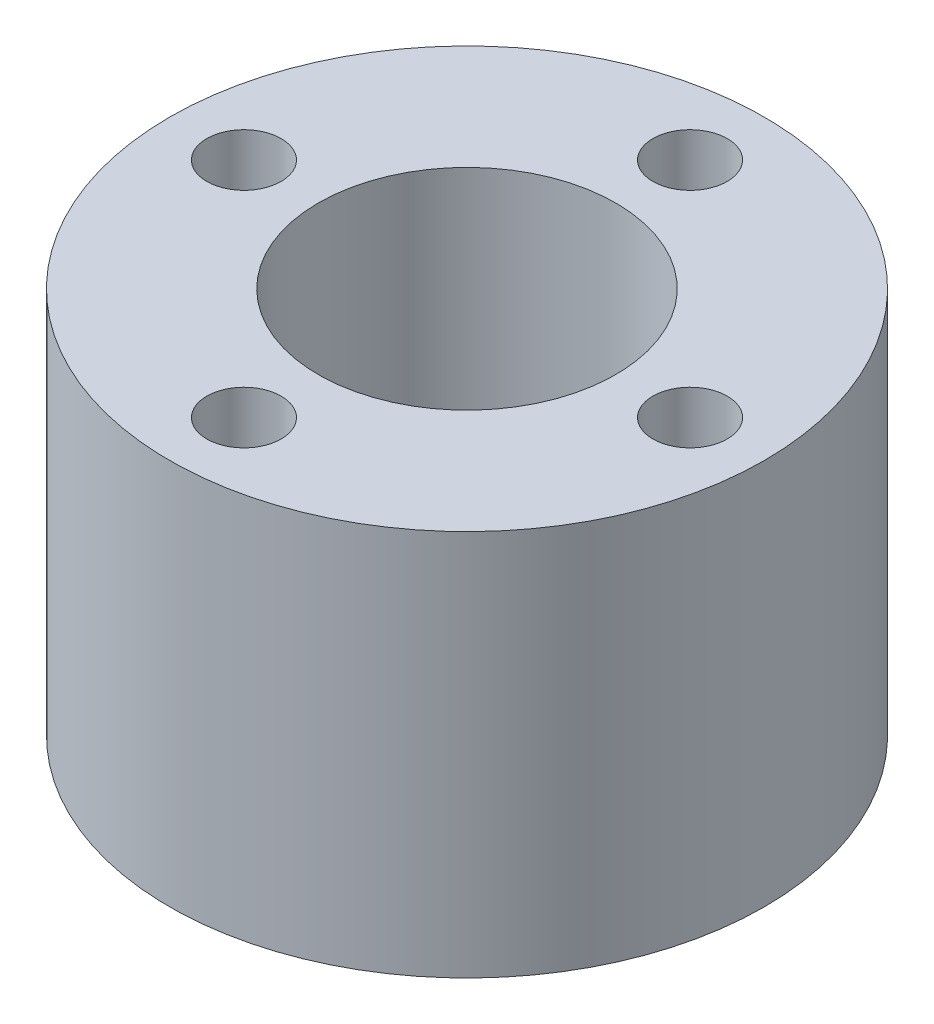
ISO-10303-21;
HEADER;
FILE_DESCRIPTION(('STEP AP214'),'2;1');
FILE_NAME('part.step','',(''),(''),'','','');
FILE_SCHEMA(('AUTOMOTIVE_DESIGN { 1 0 10303 214 1 1 1 1 }'));
ENDSEC;
DATA;
#1=APPLICATION_CONTEXT('core data for automotive mechanical design processes');
#2=APPLICATION_PROTOCOL_DEFINITION('international standard','automotive_design',2000,#1);
#3=PRODUCT_CONTEXT('',#1,'mechanical');
#4=PRODUCT('Part','Part','',(#3));
#5=PRODUCT_RELATED_PRODUCT_CATEGORY('part','',(#4));
#6=PRODUCT_DEFINITION_FORMATION('','',#4);
#7=PRODUCT_DEFINITION_CONTEXT('part definition',#1,'design');
#8=PRODUCT_DEFINITION('design','',#6,#7);
#9=PRODUCT_DEFINITION_SHAPE('','',#8);
#10=(LENGTH_UNIT() NAMED_UNIT(*) SI_UNIT(.MILLI.,.METRE.));
#11=(NAMED_UNIT(*) PLANE_ANGLE_UNIT() SI_UNIT($,.RADIAN.));
#12=(NAMED_UNIT(*) SI_UNIT($,.STERADIAN.) SOLID_ANGLE_UNIT());
#13=UNCERTAINTY_MEASURE_WITH_UNIT(LENGTH_MEASURE(1.E-05),#10,'distance_accuracy_value','');
#14=(GEOMETRIC_REPRESENTATION_CONTEXT(3) GLOBAL_UNCERTAINTY_ASSIGNED_CONTEXT((#13)) GLOBAL_UNIT_ASSIGNED_CONTEXT((#10,
#11,#12)) REPRESENTATION_CONTEXT('',''));
#15=CARTESIAN_POINT('',(0.,0.,0.));
#16=DIRECTION('',(0.,0.,1.));
#17=DIRECTION('',(1.,0.,0.));
#18=AXIS2_PLACEMENT_3D('',#15,#16,#17);
#19=CARTESIAN_POINT('',(0.,13.,0.));
#20=DIRECTION('',(0.,1.,0.));
#21=DIRECTION('',(-1.,0.,0.));
#22=AXIS2_PLACEMENT_3D('',#19,#20,#21);
#23=CYLINDRICAL_SURFACE('',#22,5.);
#24=CARTESIAN_POINT('',(0.,0.,0.));
#25=DIRECTION('',(0.,1.,0.));
#26=DIRECTION('',(-1.,0.,0.));
#27=AXIS2_PLACEMENT_3D('',#24,#25,#26);
#28=CIRCLE('',#27,5.);
#29=CARTESIAN_POINT('',(-5.,0.,0.));
#30=VERTEX_POINT('',#29);
#31=EDGE_CURVE('E52',#30,#30,#28,.T.);
#32=ORIENTED_EDGE('',*,*,#31,.F.);
#33=EDGE_LOOP('',(#32));
#34=FACE_BOUND('',#33,.T.);
#35=CARTESIAN_POINT('',(0.,13.,0.));
#36=DIRECTION('',(0.,1.,0.));
#37=DIRECTION('',(-1.,0.,0.));
#38=AXIS2_PLACEMENT_3D('',#35,#36,#37);
#39=CIRCLE('',#38,5.);
#40=CARTESIAN_POINT('',(-5.,13.,0.));
#41=VERTEX_POINT('',#40);
#42=EDGE_CURVE('E10',#41,#41,#39,.T.);
#43=ORIENTED_EDGE('',*,*,#42,.T.);
#44=EDGE_LOOP('',(#43));
#45=FACE_BOUND('',#44,.T.);
#46=ADVANCED_FACE('F39',(#34,#45),#23,.F.);
#47=CARTESIAN_POINT('',(5.,13.,0.));
#48=DIRECTION('',(0.,-1.,0.));
#49=DIRECTION('',(1.,0.,0.));
#50=AXIS2_PLACEMENT_3D('',#47,#48,#49);
#51=PLANE('',#50);
#52=CARTESIAN_POINT('',(0.,13.,-7.5));
#53=DIRECTION('',(0.,1.,0.));
#54=DIRECTION('',(0.,0.,1.));
#55=AXIS2_PLACEMENT_3D('',#52,#53,#54);
#56=CIRCLE('',#55,1.25);
#57=CARTESIAN_POINT('',(0.,13.,-6.25));
#58=VERTEX_POINT('',#57);
#59=EDGE_CURVE('E80',#58,#58,#56,.T.);
#60=ORIENTED_EDGE('',*,*,#59,.F.);
#61=EDGE_LOOP('',(#60));
#62=FACE_BOUND('',#61,.T.);
#63=CARTESIAN_POINT('',(-7.5,13.,0.));
#64=DIRECTION('',(0.,1.,0.));
#65=DIRECTION('',(0.,0.,1.));
#66=AXIS2_PLACEMENT_3D('',#63,#64,#65);
#67=CIRCLE('',#66,1.25);
#68=CARTESIAN_POINT('',(-7.5,13.,1.25));
#69=VERTEX_POINT('',#68);
#70=EDGE_CURVE('E74',#69,#69,#67,.T.);
#71=ORIENTED_EDGE('',*,*,#70,.F.);
#72=EDGE_LOOP('',(#71));
#73=FACE_BOUND('',#72,.T.);
#74=CARTESIAN_POINT('',(7.5,13.,0.));
#75=DIRECTION('',(0.,1.,0.));
#76=DIRECTION('',(0.,0.,1.));
#77=AXIS2_PLACEMENT_3D('',#74,#75,#76);
#78=CIRCLE('',#77,1.25);
#79=CARTESIAN_POINT('',(7.5,13.,1.25));
#80=VERTEX_POINT('',#79);
#81=EDGE_CURVE('E70',#80,#80,#78,.T.);
#82=ORIENTED_EDGE('',*,*,#81,.F.);
#83=EDGE_LOOP('',(#82));
#84=FACE_BOUND('',#83,.T.);
#85=CARTESIAN_POINT('',(0.,13.,7.5));
#86=DIRECTION('',(0.,1.,0.));
#87=DIRECTION('',(0.,0.,1.));
#88=AXIS2_PLACEMENT_3D('',#85,#86,#87);
#89=CIRCLE('',#88,1.25);
#90=CARTESIAN_POINT('',(0.,13.,8.75));
#91=VERTEX_POINT('',#90);
#92=EDGE_CURVE('E65',#91,#91,#89,.T.);
#93=ORIENTED_EDGE('',*,*,#92,.F.);
#94=EDGE_LOOP('',(#93));
#95=FACE_BOUND('',#94,.T.);
#96=ORIENTED_EDGE('',*,*,#42,.F.);
#97=EDGE_LOOP('',(#96));
#98=FACE_BOUND('',#97,.T.);
#99=CARTESIAN_POINT('',(0.,13.,0.));
#100=DIRECTION('',(0.,1.,0.));
#101=DIRECTION('',(-1.,0.,0.));
#102=AXIS2_PLACEMENT_3D('',#99,#100,#101);
#103=CIRCLE('',#102,10.);
#104=CARTESIAN_POINT('',(-10.,13.,0.));
#105=VERTEX_POINT('',#104);
#106=EDGE_CURVE('E44',#105,#105,#103,.T.);
#107=ORIENTED_EDGE('',*,*,#106,.T.);
#108=EDGE_LOOP('',(#107));
#109=FACE_BOUND('',#108,.T.);
#110=ADVANCED_FACE('F91',(#62,#73,#84,#95,#98,#109),#51,.F.);
#111=CARTESIAN_POINT('',(0.,13.,0.));
#112=DIRECTION('',(0.,1.,0.));
#113=DIRECTION('',(-1.,0.,0.));
#114=AXIS2_PLACEMENT_3D('',#111,#112,#113);
#115=CYLINDRICAL_SURFACE('',#114,10.);
#116=ORIENTED_EDGE('',*,*,#106,.F.);
#117=EDGE_LOOP('',(#116));
#118=FACE_BOUND('',#117,.T.);
#119=CARTESIAN_POINT('',(0.,0.,0.));
#120=DIRECTION('',(0.,1.,0.));
#121=DIRECTION('',(-1.,0.,0.));
#122=AXIS2_PLACEMENT_3D('',#119,#120,#121);
#123=CIRCLE('',#122,10.);
#124=CARTESIAN_POINT('',(-10.,0.,0.));
#125=VERTEX_POINT('',#124);
#126=EDGE_CURVE('E47',#125,#125,#123,.T.);
#127=ORIENTED_EDGE('',*,*,#126,.T.);
#128=EDGE_LOOP('',(#127));
#129=FACE_BOUND('',#128,.T.);
#130=ADVANCED_FACE('F96',(#118,#129),#115,.T.);
#131=CARTESIAN_POINT('',(10.,0.,0.));
#132=DIRECTION('',(0.,1.,0.));
#133=DIRECTION('',(-1.,0.,0.));
#134=AXIS2_PLACEMENT_3D('',#131,#132,#133);
#135=PLANE('',#134);
#136=CARTESIAN_POINT('',(0.,0.,-7.5));
#137=DIRECTION('',(0.,1.,0.));
#138=DIRECTION('',(0.,0.,1.));
#139=AXIS2_PLACEMENT_3D('',#136,#137,#138);
#140=CIRCLE('',#139,1.25);
#141=CARTESIAN_POINT('',(0.,0.,-6.25));
#142=VERTEX_POINT('',#141);
#143=EDGE_CURVE('E59',#142,#142,#140,.T.);
#144=ORIENTED_EDGE('',*,*,#143,.T.);
#145=EDGE_LOOP('',(#144));
#146=FACE_BOUND('',#145,.T.);
#147=CARTESIAN_POINT('',(-7.5,0.,0.));
#148=DIRECTION('',(0.,1.,0.));
#149=DIRECTION('',(0.,0.,1.));
#150=AXIS2_PLACEMENT_3D('',#147,#148,#149);
#151=CIRCLE('',#150,1.25);
#152=CARTESIAN_POINT('',(-7.5,0.,1.25));
#153=VERTEX_POINT('',#152);
#154=EDGE_CURVE('E72',#153,#153,#151,.T.);
#155=ORIENTED_EDGE('',*,*,#154,.T.);
#156=EDGE_LOOP('',(#155));
#157=FACE_BOUND('',#156,.T.);
#158=CARTESIAN_POINT('',(7.5,0.,0.));
#159=DIRECTION('',(0.,1.,0.));
#160=DIRECTION('',(0.,0.,1.));
#161=AXIS2_PLACEMENT_3D('',#158,#159,#160);
#162=CIRCLE('',#161,1.25);
#163=CARTESIAN_POINT('',(7.5,0.,1.25));
#164=VERTEX_POINT('',#163);
#165=EDGE_CURVE('E61',#164,#164,#162,.T.);
#166=ORIENTED_EDGE('',*,*,#165,.T.);
#167=EDGE_LOOP('',(#166));
#168=FACE_BOUND('',#167,.T.);
#169=CARTESIAN_POINT('',(0.,0.,7.5));
#170=DIRECTION('',(0.,1.,0.));
#171=DIRECTION('',(0.,0.,1.));
#172=AXIS2_PLACEMENT_3D('',#169,#170,#171);
#173=CIRCLE('',#172,1.25);
#174=CARTESIAN_POINT('',(0.,0.,8.75));
#175=VERTEX_POINT('',#174);
#176=EDGE_CURVE('E56',#175,#175,#173,.T.);
#177=ORIENTED_EDGE('',*,*,#176,.T.);
#178=EDGE_LOOP('',(#177));
#179=FACE_BOUND('',#178,.T.);
#180=ORIENTED_EDGE('',*,*,#126,.F.);
#181=EDGE_LOOP('',(#180));
#182=FACE_BOUND('',#181,.T.);
#183=ORIENTED_EDGE('',*,*,#31,.T.);
#184=EDGE_LOOP('',(#183));
#185=FACE_BOUND('',#184,.T.);
#186=ADVANCED_FACE('F85',(#146,#157,#168,#179,#182,#185),#135,.F.);
#187=CARTESIAN_POINT('',(0.,0.,7.5));
#188=DIRECTION('',(0.,1.,0.));
#189=DIRECTION('',(0.,0.,1.));
#190=AXIS2_PLACEMENT_3D('',#187,#188,#189);
#191=CYLINDRICAL_SURFACE('',#190,1.25);
#192=CARTESIAN_POINT('',(0.,0.,8.75));
#193=CARTESIAN_POINT('',(0.,0.135416666666666,8.75));
#194=CARTESIAN_POINT('',(0.,0.270833333333333,8.75));
#195=CARTESIAN_POINT('',(0.,0.541666666666667,8.75));
#196=CARTESIAN_POINT('',(0.,0.677083333333333,8.75));
#197=CARTESIAN_POINT('',(0.,0.947916666666667,8.75));
#198=CARTESIAN_POINT('',(0.,1.08333333333333,8.75));
#199=CARTESIAN_POINT('',(0.,1.35416666666667,8.75));
#200=CARTESIAN_POINT('',(0.,1.48958333333333,8.75));
#201=CARTESIAN_POINT('',(0.,1.76041666666667,8.75));
#202=CARTESIAN_POINT('',(0.,1.89583333333333,8.75));
#203=CARTESIAN_POINT('',(0.,2.16666666666667,8.75));
#204=CARTESIAN_POINT('',(0.,2.30208333333333,8.75));
#205=CARTESIAN_POINT('',(0.,2.57291666666667,8.75));
#206=CARTESIAN_POINT('',(0.,2.70833333333333,8.75));
#207=CARTESIAN_POINT('',(0.,2.97916666666667,8.75));
#208=CARTESIAN_POINT('',(0.,3.11458333333333,8.75));
#209=CARTESIAN_POINT('',(0.,3.38541666666667,8.75));
#210=CARTESIAN_POINT('',(0.,3.52083333333333,8.75));
#211=CARTESIAN_POINT('',(0.,3.79166666666667,8.75));
#212=CARTESIAN_POINT('',(0.,3.92708333333333,8.75));
#213=CARTESIAN_POINT('',(0.,4.19791666666667,8.75));
#214=CARTESIAN_POINT('',(0.,4.33333333333333,8.75));
#215=CARTESIAN_POINT('',(0.,4.60416666666667,8.75));
#216=CARTESIAN_POINT('',(0.,4.73958333333333,8.75));
#217=CARTESIAN_POINT('',(0.,5.01041666666667,8.75));
#218=CARTESIAN_POINT('',(0.,5.14583333333333,8.75));
#219=CARTESIAN_POINT('',(0.,5.41666666666667,8.75));
#220=CARTESIAN_POINT('',(0.,5.55208333333333,8.75));
#221=CARTESIAN_POINT('',(0.,5.82291666666667,8.75));
#222=CARTESIAN_POINT('',(0.,5.95833333333333,8.75));
#223=CARTESIAN_POINT('',(0.,6.22916666666667,8.75));
#224=CARTESIAN_POINT('',(0.,6.36458333333333,8.75));
#225=CARTESIAN_POINT('',(0.,6.63541666666667,8.75));
#226=CARTESIAN_POINT('',(0.,6.77083333333333,8.75));
#227=CARTESIAN_POINT('',(0.,7.04166666666667,8.75));
#228=CARTESIAN_POINT('',(0.,7.17708333333333,8.75));
#229=CARTESIAN_POINT('',(0.,7.44791666666667,8.75));
#230=CARTESIAN_POINT('',(0.,7.58333333333333,8.75));
#231=CARTESIAN_POINT('',(0.,7.85416666666667,8.75));
#232=CARTESIAN_POINT('',(0.,7.98958333333333,8.75));
#233=CARTESIAN_POINT('',(0.,8.26041666666667,8.75));
#234=CARTESIAN_POINT('',(0.,8.39583333333333,8.75));
#235=CARTESIAN_POINT('',(0.,8.66666666666667,8.75));
#236=CARTESIAN_POINT('',(0.,8.80208333333333,8.75));
#237=CARTESIAN_POINT('',(0.,9.07291666666667,8.75));
#238=CARTESIAN_POINT('',(0.,9.20833333333333,8.75));
#239=CARTESIAN_POINT('',(0.,9.47916666666667,8.75));
#240=CARTESIAN_POINT('',(0.,9.61458333333333,8.75));
#241=CARTESIAN_POINT('',(0.,9.88541666666667,8.75));
#242=CARTESIAN_POINT('',(0.,10.0208333333333,8.75));
#243=CARTESIAN_POINT('',(0.,10.2916666666667,8.75));
#244=CARTESIAN_POINT('',(0.,10.4270833333333,8.75));
#245=CARTESIAN_POINT('',(0.,10.6979166666667,8.75));
#246=CARTESIAN_POINT('',(0.,10.8333333333333,8.75));
#247=CARTESIAN_POINT('',(0.,11.1041666666667,8.75));
#248=CARTESIAN_POINT('',(0.,11.2395833333333,8.75));
#249=CARTESIAN_POINT('',(0.,11.5104166666667,8.75));
#250=CARTESIAN_POINT('',(0.,11.6458333333333,8.75));
#251=CARTESIAN_POINT('',(0.,11.9166666666667,8.75));
#252=CARTESIAN_POINT('',(0.,12.0520833333333,8.75));
#253=CARTESIAN_POINT('',(0.,12.3229166666667,8.75));
#254=CARTESIAN_POINT('',(0.,12.4583333333333,8.75));
#255=CARTESIAN_POINT('',(0.,12.7291666666667,8.75));
#256=CARTESIAN_POINT('',(0.,12.8645833333333,8.75));
#257=CARTESIAN_POINT('',(0.,13.,8.75));
#258=B_SPLINE_CURVE_WITH_KNOTS('',3,(#192,#193,#194,#195,#196,#197,#198,#199,#200,#201,#202,
#203,#204,#205,#206,#207,#208,#209,#210,#211,#212,#213,#214,#215,#216,#217,#218,#219,#220,#221,
#222,#223,#224,#225,#226,#227,#228,#229,#230,#231,#232,#233,#234,#235,#236,#237,#238,#239,#240,
#241,#242,#243,#244,#245,#246,#247,#248,#249,#250,#251,#252,#253,#254,#255,#256,#257),
.UNSPECIFIED.,.F.,.F.,(4,2,2,2,2,2,2,2,2,2,2,2,2,2,2,2,2,2,2,2,2,2,2,2,2,2,2,2,2,2,2,2,4),(0.,
0.40625,0.8125,1.21875,1.625,2.03125,2.4375,2.84375,3.25,3.65625,4.0625,4.46875,4.875,5.28125,
5.6875,6.09375,6.5,6.90625,7.3125,7.71875,8.125,8.53125,8.9375,9.34375,9.75,10.15625,10.5625,
10.96875,11.375,11.78125,12.1875,12.59375,13.),.UNSPECIFIED.);
#259=EDGE_CURVE('BSEAM102',#175,#91,#258,.T.);
#260=ORIENTED_EDGE('',*,*,#176,.F.);
#261=ORIENTED_EDGE('',*,*,#92,.T.);
#262=ORIENTED_EDGE('',*,*,#259,.T.);
#263=ORIENTED_EDGE('',*,*,#259,.F.);
#264=EDGE_LOOP('',(#260,#262,#261,#263));
#265=FACE_BOUND('',#264,.T.);
#266=ADVANCED_FACE('F102',(#265),#191,.F.);
#267=CARTESIAN_POINT('',(7.5,0.,0.));
#268=DIRECTION('',(0.,1.,0.));
#269=DIRECTION('',(0.,0.,1.));
#270=AXIS2_PLACEMENT_3D('',#267,#268,#269);
#271=CYLINDRICAL_SURFACE('',#270,1.25);
#272=CARTESIAN_POINT('',(7.5,0.,1.25));
#273=CARTESIAN_POINT('',(7.5,0.135416666666666,1.25));
#274=CARTESIAN_POINT('',(7.5,0.270833333333333,1.25));
#275=CARTESIAN_POINT('',(7.5,0.541666666666667,1.25));
#276=CARTESIAN_POINT('',(7.5,0.677083333333333,1.25));
#277=CARTESIAN_POINT('',(7.5,0.947916666666667,1.25));
#278=CARTESIAN_POINT('',(7.5,1.08333333333333,1.25));
#279=CARTESIAN_POINT('',(7.5,1.35416666666667,1.25));
#280=CARTESIAN_POINT('',(7.5,1.48958333333333,1.25));
#281=CARTESIAN_POINT('',(7.5,1.76041666666667,1.25));
#282=CARTESIAN_POINT('',(7.5,1.89583333333333,1.25));
#283=CARTESIAN_POINT('',(7.5,2.16666666666667,1.25));
#284=CARTESIAN_POINT('',(7.5,2.30208333333333,1.25));
#285=CARTESIAN_POINT('',(7.5,2.57291666666667,1.25));
#286=CARTESIAN_POINT('',(7.5,2.70833333333333,1.25));
#287=CARTESIAN_POINT('',(7.5,2.97916666666667,1.25));
#288=CARTESIAN_POINT('',(7.5,3.11458333333333,1.25));
#289=CARTESIAN_POINT('',(7.5,3.38541666666667,1.25));
#290=CARTESIAN_POINT('',(7.5,3.52083333333333,1.25));
#291=CARTESIAN_POINT('',(7.5,3.79166666666667,1.25));
#292=CARTESIAN_POINT('',(7.5,3.92708333333333,1.25));
#293=CARTESIAN_POINT('',(7.5,4.19791666666667,1.25));
#294=CARTESIAN_POINT('',(7.5,4.33333333333333,1.25));
#295=CARTESIAN_POINT('',(7.5,4.60416666666667,1.25));
#296=CARTESIAN_POINT('',(7.5,4.73958333333333,1.25));
#297=CARTESIAN_POINT('',(7.5,5.01041666666667,1.25));
#298=CARTESIAN_POINT('',(7.5,5.14583333333333,1.25));
#299=CARTESIAN_POINT('',(7.5,5.41666666666667,1.25));
#300=CARTESIAN_POINT('',(7.5,5.55208333333333,1.25));
#301=CARTESIAN_POINT('',(7.5,5.82291666666667,1.25));
#302=CARTESIAN_POINT('',(7.5,5.95833333333333,1.25));
#303=CARTESIAN_POINT('',(7.5,6.22916666666667,1.25));
#304=CARTESIAN_POINT('',(7.5,6.36458333333333,1.25));
#305=CARTESIAN_POINT('',(7.5,6.63541666666667,1.25));
#306=CARTESIAN_POINT('',(7.5,6.77083333333333,1.25));
#307=CARTESIAN_POINT('',(7.5,7.04166666666667,1.25));
#308=CARTESIAN_POINT('',(7.5,7.17708333333333,1.25));
#309=CARTESIAN_POINT('',(7.5,7.44791666666667,1.25));
#310=CARTESIAN_POINT('',(7.5,7.58333333333333,1.25));
#311=CARTESIAN_POINT('',(7.5,7.85416666666667,1.25));
#312=CARTESIAN_POINT('',(7.5,7.98958333333333,1.25));
#313=CARTESIAN_POINT('',(7.5,8.26041666666667,1.25));
#314=CARTESIAN_POINT('',(7.5,8.39583333333333,1.25));
#315=CARTESIAN_POINT('',(7.5,8.66666666666667,1.25));
#316=CARTESIAN_POINT('',(7.5,8.80208333333333,1.25));
#317=CARTESIAN_POINT('',(7.5,9.07291666666667,1.25));
#318=CARTESIAN_POINT('',(7.5,9.20833333333333,1.25));
#319=CARTESIAN_POINT('',(7.5,9.47916666666667,1.25));
#320=CARTESIAN_POINT('',(7.5,9.61458333333333,1.25));
#321=CARTESIAN_POINT('',(7.5,9.88541666666667,1.25));
#322=CARTESIAN_POINT('',(7.5,10.0208333333333,1.25));
#323=CARTESIAN_POINT('',(7.5,10.2916666666667,1.25));
#324=CARTESIAN_POINT('',(7.5,10.4270833333333,1.25));
#325=CARTESIAN_POINT('',(7.5,10.6979166666667,1.25));
#326=CARTESIAN_POINT('',(7.5,10.8333333333333,1.25));
#327=CARTESIAN_POINT('',(7.5,11.1041666666667,1.25));
#328=CARTESIAN_POINT('',(7.5,11.2395833333333,1.25));
#329=CARTESIAN_POINT('',(7.5,11.5104166666667,1.25));
#330=CARTESIAN_POINT('',(7.5,11.6458333333333,1.25));
#331=CARTESIAN_POINT('',(7.5,11.9166666666667,1.25));
#332=CARTESIAN_POINT('',(7.5,12.0520833333333,1.25));
#333=CARTESIAN_POINT('',(7.5,12.3229166666667,1.25));
#334=CARTESIAN_POINT('',(7.5,12.4583333333333,1.25));
#335=CARTESIAN_POINT('',(7.5,12.7291666666667,1.25));
#336=CARTESIAN_POINT('',(7.5,12.8645833333333,1.25));
#337=CARTESIAN_POINT('',(7.5,13.,1.25));
#338=B_SPLINE_CURVE_WITH_KNOTS('',3,(#272,#273,#274,#275,#276,#277,#278,#279,#280,#281,#282,
#283,#284,#285,#286,#287,#288,#289,#290,#291,#292,#293,#294,#295,#296,#297,#298,#299,#300,#301,
#302,#303,#304,#305,#306,#307,#308,#309,#310,#311,#312,#313,#314,#315,#316,#317,#318,#319,#320,
#321,#322,#323,#324,#325,#326,#327,#328,#329,#330,#331,#332,#333,#334,#335,#336,#337),
.UNSPECIFIED.,.F.,.F.,(4,2,2,2,2,2,2,2,2,2,2,2,2,2,2,2,2,2,2,2,2,2,2,2,2,2,2,2,2,2,2,2,4),(0.,
0.40625,0.8125,1.21875,1.625,2.03125,2.4375,2.84375,3.25,3.65625,4.0625,4.46875,4.875,5.28125,
5.6875,6.09375,6.5,6.90625,7.3125,7.71875,8.125,8.53125,8.9375,9.34375,9.75,10.15625,10.5625,
10.96875,11.375,11.78125,12.1875,12.59375,13.),.UNSPECIFIED.);
#339=EDGE_CURVE('BSEAM106',#164,#80,#338,.T.);
#340=ORIENTED_EDGE('',*,*,#165,.F.);
#341=ORIENTED_EDGE('',*,*,#81,.T.);
#342=ORIENTED_EDGE('',*,*,#339,.T.);
#343=ORIENTED_EDGE('',*,*,#339,.F.);
#344=EDGE_LOOP('',(#340,#342,#341,#343));
#345=FACE_BOUND('',#344,.T.);
#346=ADVANCED_FACE('F106',(#345),#271,.F.);
#347=CARTESIAN_POINT('',(-7.5,0.,0.));
#348=DIRECTION('',(0.,1.,0.));
#349=DIRECTION('',(0.,0.,1.));
#350=AXIS2_PLACEMENT_3D('',#347,#348,#349);
#351=CYLINDRICAL_SURFACE('',#350,1.25);
#352=CARTESIAN_POINT('',(-7.5,0.,1.25));
#353=CARTESIAN_POINT('',(-7.5,0.135416666666666,1.25));
#354=CARTESIAN_POINT('',(-7.5,0.270833333333333,1.25));
#355=CARTESIAN_POINT('',(-7.5,0.541666666666667,1.25));
#356=CARTESIAN_POINT('',(-7.5,0.677083333333333,1.25));
#357=CARTESIAN_POINT('',(-7.5,0.947916666666667,1.25));
#358=CARTESIAN_POINT('',(-7.5,1.08333333333333,1.25));
#359=CARTESIAN_POINT('',(-7.5,1.35416666666667,1.25));
#360=CARTESIAN_POINT('',(-7.5,1.48958333333333,1.25));
#361=CARTESIAN_POINT('',(-7.5,1.76041666666667,1.25));
#362=CARTESIAN_POINT('',(-7.5,1.89583333333333,1.25));
#363=CARTESIAN_POINT('',(-7.5,2.16666666666667,1.25));
#364=CARTESIAN_POINT('',(-7.5,2.30208333333333,1.25));
#365=CARTESIAN_POINT('',(-7.5,2.57291666666667,1.25));
#366=CARTESIAN_POINT('',(-7.5,2.70833333333333,1.25));
#367=CARTESIAN_POINT('',(-7.5,2.97916666666667,1.25));
#368=CARTESIAN_POINT('',(-7.5,3.11458333333333,1.25));
#369=CARTESIAN_POINT('',(-7.5,3.38541666666667,1.25));
#370=CARTESIAN_POINT('',(-7.5,3.52083333333333,1.25));
#371=CARTESIAN_POINT('',(-7.5,3.79166666666667,1.25));
#372=CARTESIAN_POINT('',(-7.5,3.92708333333333,1.25));
#373=CARTESIAN_POINT('',(-7.5,4.19791666666667,1.25));
#374=CARTESIAN_POINT('',(-7.5,4.33333333333333,1.25));
#375=CARTESIAN_POINT('',(-7.5,4.60416666666667,1.25));
#376=CARTESIAN_POINT('',(-7.5,4.73958333333333,1.25));
#377=CARTESIAN_POINT('',(-7.5,5.01041666666667,1.25));
#378=CARTESIAN_POINT('',(-7.5,5.14583333333333,1.25));
#379=CARTESIAN_POINT('',(-7.5,5.41666666666667,1.25));
#380=CARTESIAN_POINT('',(-7.5,5.55208333333333,1.25));
#381=CARTESIAN_POINT('',(-7.5,5.82291666666667,1.25));
#382=CARTESIAN_POINT('',(-7.5,5.95833333333333,1.25));
#383=CARTESIAN_POINT('',(-7.5,6.22916666666667,1.25));
#384=CARTESIAN_POINT('',(-7.5,6.36458333333333,1.25));
#385=CARTESIAN_POINT('',(-7.5,6.63541666666667,1.25));
#386=CARTESIAN_POINT('',(-7.5,6.77083333333333,1.25));
#387=CARTESIAN_POINT('',(-7.5,7.04166666666667,1.25));
#388=CARTESIAN_POINT('',(-7.5,7.17708333333333,1.25));
#389=CARTESIAN_POINT('',(-7.5,7.44791666666667,1.25));
#390=CARTESIAN_POINT('',(-7.5,7.58333333333333,1.25));
#391=CARTESIAN_POINT('',(-7.5,7.85416666666667,1.25));
#392=CARTESIAN_POINT('',(-7.5,7.98958333333333,1.25));
#393=CARTESIAN_POINT('',(-7.5,8.26041666666667,1.25));
#394=CARTESIAN_POINT('',(-7.5,8.39583333333333,1.25));
#395=CARTESIAN_POINT('',(-7.5,8.66666666666667,1.25));
#396=CARTESIAN_POINT('',(-7.5,8.80208333333333,1.25));
#397=CARTESIAN_POINT('',(-7.5,9.07291666666667,1.25));
#398=CARTESIAN_POINT('',(-7.5,9.20833333333333,1.25));
#399=CARTESIAN_POINT('',(-7.5,9.47916666666667,1.25));
#400=CARTESIAN_POINT('',(-7.5,9.61458333333333,1.25));
#401=CARTESIAN_POINT('',(-7.5,9.88541666666667,1.25));
#402=CARTESIAN_POINT('',(-7.5,10.0208333333333,1.25));
#403=CARTESIAN_POINT('',(-7.5,10.2916666666667,1.25));
#404=CARTESIAN_POINT('',(-7.5,10.4270833333333,1.25));
#405=CARTESIAN_POINT('',(-7.5,10.6979166666667,1.25));
#406=CARTESIAN_POINT('',(-7.5,10.8333333333333,1.25));
#407=CARTESIAN_POINT('',(-7.5,11.1041666666667,1.25));
#408=CARTESIAN_POINT('',(-7.5,11.2395833333333,1.25));
#409=CARTESIAN_POINT('',(-7.5,11.5104166666667,1.25));
#410=CARTESIAN_POINT('',(-7.5,11.6458333333333,1.25));
#411=CARTESIAN_POINT('',(-7.5,11.9166666666667,1.25));
#412=CARTESIAN_POINT('',(-7.5,12.0520833333333,1.25));
#413=CARTESIAN_POINT('',(-7.5,12.3229166666667,1.25));
#414=CARTESIAN_POINT('',(-7.5,12.4583333333333,1.25));
#415=CARTESIAN_POINT('',(-7.5,12.7291666666667,1.25));
#416=CARTESIAN_POINT('',(-7.5,12.8645833333333,1.25));
#417=CARTESIAN_POINT('',(-7.5,13.,1.25));
#418=B_SPLINE_CURVE_WITH_KNOTS('',3,(#352,#353,#354,#355,#356,#357,#358,#359,#360,#361,#362,
#363,#364,#365,#366,#367,#368,#369,#370,#371,#372,#373,#374,#375,#376,#377,#378,#379,#380,#381,
#382,#383,#384,#385,#386,#387,#388,#389,#390,#391,#392,#393,#394,#395,#396,#397,#398,#399,#400,
#401,#402,#403,#404,#405,#406,#407,#408,#409,#410,#411,#412,#413,#414,#415,#416,#417),
.UNSPECIFIED.,.F.,.F.,(4,2,2,2,2,2,2,2,2,2,2,2,2,2,2,2,2,2,2,2,2,2,2,2,2,2,2,2,2,2,2,2,4),(0.,
0.40625,0.8125,1.21875,1.625,2.03125,2.4375,2.84375,3.25,3.65625,4.0625,4.46875,4.875,5.28125,
5.6875,6.09375,6.5,6.90625,7.3125,7.71875,8.125,8.53125,8.9375,9.34375,9.75,10.15625,10.5625,
10.96875,11.375,11.78125,12.1875,12.59375,13.),.UNSPECIFIED.);
#419=EDGE_CURVE('BSEAM90',#153,#69,#418,.T.);
#420=ORIENTED_EDGE('',*,*,#154,.F.);
#421=ORIENTED_EDGE('',*,*,#70,.T.);
#422=ORIENTED_EDGE('',*,*,#419,.T.);
#423=ORIENTED_EDGE('',*,*,#419,.F.);
#424=EDGE_LOOP('',(#420,#422,#421,#423));
#425=FACE_BOUND('',#424,.T.);
#426=ADVANCED_FACE('F90',(#425),#351,.F.);
#427=CARTESIAN_POINT('',(0.,0.,-7.5));
#428=DIRECTION('',(0.,1.,0.));
#429=DIRECTION('',(0.,0.,1.));
#430=AXIS2_PLACEMENT_3D('',#427,#428,#429);
#431=CYLINDRICAL_SURFACE('',#430,1.25);
#432=CARTESIAN_POINT('',(0.,0.,-6.25));
#433=CARTESIAN_POINT('',(0.,0.135416666666666,-6.25));
#434=CARTESIAN_POINT('',(0.,0.270833333333333,-6.25));
#435=CARTESIAN_POINT('',(0.,0.541666666666667,-6.25));
#436=CARTESIAN_POINT('',(0.,0.677083333333333,-6.25));
#437=CARTESIAN_POINT('',(0.,0.947916666666667,-6.25));
#438=CARTESIAN_POINT('',(0.,1.08333333333333,-6.25));
#439=CARTESIAN_POINT('',(0.,1.35416666666667,-6.25));
#440=CARTESIAN_POINT('',(0.,1.48958333333333,-6.25));
#441=CARTESIAN_POINT('',(0.,1.76041666666667,-6.25));
#442=CARTESIAN_POINT('',(0.,1.89583333333333,-6.25));
#443=CARTESIAN_POINT('',(0.,2.16666666666667,-6.25));
#444=CARTESIAN_POINT('',(0.,2.30208333333333,-6.25));
#445=CARTESIAN_POINT('',(0.,2.57291666666667,-6.25));
#446=CARTESIAN_POINT('',(0.,2.70833333333333,-6.25));
#447=CARTESIAN_POINT('',(0.,2.97916666666667,-6.25));
#448=CARTESIAN_POINT('',(0.,3.11458333333333,-6.25));
#449=CARTESIAN_POINT('',(0.,3.38541666666667,-6.25));
#450=CARTESIAN_POINT('',(0.,3.52083333333333,-6.25));
#451=CARTESIAN_POINT('',(0.,3.79166666666667,-6.25));
#452=CARTESIAN_POINT('',(0.,3.92708333333333,-6.25));
#453=CARTESIAN_POINT('',(0.,4.19791666666667,-6.25));
#454=CARTESIAN_POINT('',(0.,4.33333333333333,-6.25));
#455=CARTESIAN_POINT('',(0.,4.60416666666667,-6.25));
#456=CARTESIAN_POINT('',(0.,4.73958333333333,-6.25));
#457=CARTESIAN_POINT('',(0.,5.01041666666667,-6.25));
#458=CARTESIAN_POINT('',(0.,5.14583333333333,-6.25));
#459=CARTESIAN_POINT('',(0.,5.41666666666667,-6.25));
#460=CARTESIAN_POINT('',(0.,5.55208333333333,-6.25));
#461=CARTESIAN_POINT('',(0.,5.82291666666667,-6.25));
#462=CARTESIAN_POINT('',(0.,5.95833333333333,-6.25));
#463=CARTESIAN_POINT('',(0.,6.22916666666667,-6.25));
#464=CARTESIAN_POINT('',(0.,6.36458333333333,-6.25));
#465=CARTESIAN_POINT('',(0.,6.63541666666667,-6.25));
#466=CARTESIAN_POINT('',(0.,6.77083333333333,-6.25));
#467=CARTESIAN_POINT('',(0.,7.04166666666667,-6.25));
#468=CARTESIAN_POINT('',(0.,7.17708333333333,-6.25));
#469=CARTESIAN_POINT('',(0.,7.44791666666667,-6.25));
#470=CARTESIAN_POINT('',(0.,7.58333333333333,-6.25));
#471=CARTESIAN_POINT('',(0.,7.85416666666667,-6.25));
#472=CARTESIAN_POINT('',(0.,7.98958333333333,-6.25));
#473=CARTESIAN_POINT('',(0.,8.26041666666667,-6.25));
#474=CARTESIAN_POINT('',(0.,8.39583333333333,-6.25));
#475=CARTESIAN_POINT('',(0.,8.66666666666667,-6.25));
#476=CARTESIAN_POINT('',(0.,8.80208333333333,-6.25));
#477=CARTESIAN_POINT('',(0.,9.07291666666667,-6.25));
#478=CARTESIAN_POINT('',(0.,9.20833333333333,-6.25));
#479=CARTESIAN_POINT('',(0.,9.47916666666667,-6.25));
#480=CARTESIAN_POINT('',(0.,9.61458333333333,-6.25));
#481=CARTESIAN_POINT('',(0.,9.88541666666667,-6.25));
#482=CARTESIAN_POINT('',(0.,10.0208333333333,-6.25));
#483=CARTESIAN_POINT('',(0.,10.2916666666667,-6.25));
#484=CARTESIAN_POINT('',(0.,10.4270833333333,-6.25));
#485=CARTESIAN_POINT('',(0.,10.6979166666667,-6.25));
#486=CARTESIAN_POINT('',(0.,10.8333333333333,-6.25));
#487=CARTESIAN_POINT('',(0.,11.1041666666667,-6.25));
#488=CARTESIAN_POINT('',(0.,11.2395833333333,-6.25));
#489=CARTESIAN_POINT('',(0.,11.5104166666667,-6.25));
#490=CARTESIAN_POINT('',(0.,11.6458333333333,-6.25));
#491=CARTESIAN_POINT('',(0.,11.9166666666667,-6.25));
#492=CARTESIAN_POINT('',(0.,12.0520833333333,-6.25));
#493=CARTESIAN_POINT('',(0.,12.3229166666667,-6.25));
#494=CARTESIAN_POINT('',(0.,12.4583333333333,-6.25));
#495=CARTESIAN_POINT('',(0.,12.7291666666667,-6.25));
#496=CARTESIAN_POINT('',(0.,12.8645833333333,-6.25));
#497=CARTESIAN_POINT('',(0.,13.,-6.25));
#498=B_SPLINE_CURVE_WITH_KNOTS('',3,(#432,#433,#434,#435,#436,#437,#438,#439,#440,#441,#442,
#443,#444,#445,#446,#447,#448,#449,#450,#451,#452,#453,#454,#455,#456,#457,#458,#459,#460,#461,
#462,#463,#464,#465,#466,#467,#468,#469,#470,#471,#472,#473,#474,#475,#476,#477,#478,#479,#480,
#481,#482,#483,#484,#485,#486,#487,#488,#489,#490,#491,#492,#493,#494,#495,#496,#497),
.UNSPECIFIED.,.F.,.F.,(4,2,2,2,2,2,2,2,2,2,2,2,2,2,2,2,2,2,2,2,2,2,2,2,2,2,2,2,2,2,2,2,4),(0.,
0.40625,0.8125,1.21875,1.625,2.03125,2.4375,2.84375,3.25,3.65625,4.0625,4.46875,4.875,5.28125,
5.6875,6.09375,6.5,6.90625,7.3125,7.71875,8.125,8.53125,8.9375,9.34375,9.75,10.15625,10.5625,
10.96875,11.375,11.78125,12.1875,12.59375,13.),.UNSPECIFIED.);
#499=EDGE_CURVE('BSEAM88',#142,#58,#498,.T.);
#500=ORIENTED_EDGE('',*,*,#143,.F.);
#501=ORIENTED_EDGE('',*,*,#59,.T.);
#502=ORIENTED_EDGE('',*,*,#499,.T.);
#503=ORIENTED_EDGE('',*,*,#499,.F.);
#504=EDGE_LOOP('',(#500,#502,#501,#503));
#505=FACE_BOUND('',#504,.T.);
#506=ADVANCED_FACE('F88',(#505),#431,.F.);
#507=CLOSED_SHELL('',(#46,#110,#130,#186,#266,#346,#426,#506));
#508=MANIFOLD_SOLID_BREP('B2',#507);
#509=ADVANCED_BREP_SHAPE_REPRESENTATION('',(#18,#508),#14);
#510=SHAPE_DEFINITION_REPRESENTATION(#9,#509);
ENDSEC;
END-ISO-10303-21;
